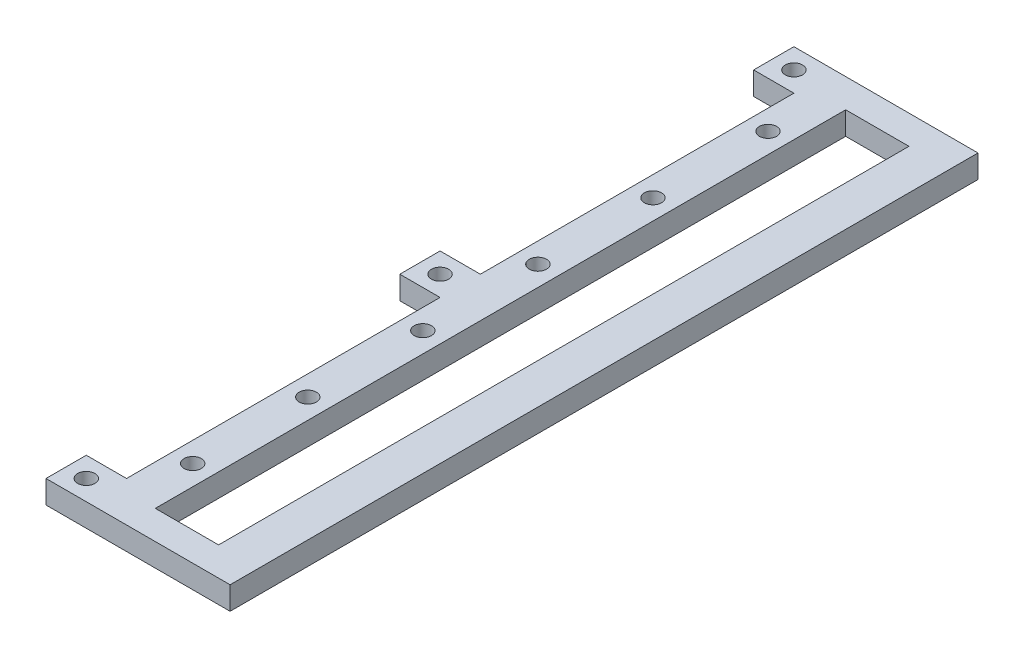
ISO-10303-21;
HEADER;
FILE_DESCRIPTION(('STEP AP214'),'2;1');
FILE_NAME('part.step','',(''),(''),'','','');
FILE_SCHEMA(('AUTOMOTIVE_DESIGN { 1 0 10303 214 1 1 1 1 }'));
ENDSEC;
DATA;
#1=APPLICATION_CONTEXT('core data for automotive mechanical design processes');
#2=APPLICATION_PROTOCOL_DEFINITION('international standard','automotive_design',2000,#1);
#3=PRODUCT_CONTEXT('',#1,'mechanical');
#4=PRODUCT('Part','Part','',(#3));
#5=PRODUCT_RELATED_PRODUCT_CATEGORY('part','',(#4));
#6=PRODUCT_DEFINITION_FORMATION('','',#4);
#7=PRODUCT_DEFINITION_CONTEXT('part definition',#1,'design');
#8=PRODUCT_DEFINITION('design','',#6,#7);
#9=PRODUCT_DEFINITION_SHAPE('','',#8);
#10=(LENGTH_UNIT() NAMED_UNIT(*) SI_UNIT(.MILLI.,.METRE.));
#11=(NAMED_UNIT(*) PLANE_ANGLE_UNIT() SI_UNIT($,.RADIAN.));
#12=(NAMED_UNIT(*) SI_UNIT($,.STERADIAN.) SOLID_ANGLE_UNIT());
#13=UNCERTAINTY_MEASURE_WITH_UNIT(LENGTH_MEASURE(1.E-05),#10,'distance_accuracy_value','');
#14=(GEOMETRIC_REPRESENTATION_CONTEXT(3) GLOBAL_UNCERTAINTY_ASSIGNED_CONTEXT((#13)) GLOBAL_UNIT_ASSIGNED_CONTEXT((#10,
#11,#12)) REPRESENTATION_CONTEXT('',''));
#15=CARTESIAN_POINT('',(0.,0.,0.));
#16=DIRECTION('',(0.,0.,1.));
#17=DIRECTION('',(1.,0.,0.));
#18=AXIS2_PLACEMENT_3D('',#15,#16,#17);
#19=CARTESIAN_POINT('',(0.,4.,0.));
#20=DIRECTION('',(0.,1.,0.));
#21=DIRECTION('',(0.,0.,1.));
#22=AXIS2_PLACEMENT_3D('',#19,#20,#21);
#23=PLANE('',#22);
#24=CARTESIAN_POINT('',(-16.,4.,0.));
#25=DIRECTION('',(0.,1.,0.));
#26=DIRECTION('',(0.,0.,1.));
#27=AXIS2_PLACEMENT_3D('',#24,#25,#26);
#28=CIRCLE('',#27,1.5);
#29=CARTESIAN_POINT('',(-16.,4.,1.50000000000001));
#30=VERTEX_POINT('',#29);
#31=EDGE_CURVE('E379',#30,#30,#28,.T.);
#32=ORIENTED_EDGE('',*,*,#31,.F.);
#33=EDGE_LOOP('',(#32));
#34=FACE_BOUND('',#33,.T.);
#35=CARTESIAN_POINT('',(-8.99999999999864,4.,30.));
#36=DIRECTION('',(0.,1.,0.));
#37=DIRECTION('',(0.,0.,-1.));
#38=AXIS2_PLACEMENT_3D('',#35,#36,#37);
#39=CIRCLE('',#38,1.5);
#40=CARTESIAN_POINT('',(-8.99999999999864,4.,28.5));
#41=VERTEX_POINT('',#40);
#42=EDGE_CURVE('E392',#41,#41,#39,.T.);
#43=ORIENTED_EDGE('',*,*,#42,.F.);
#44=EDGE_LOOP('',(#43));
#45=FACE_BOUND('',#44,.T.);
#46=CARTESIAN_POINT('',(-8.99999999999947,4.,-50.));
#47=DIRECTION('',(0.,1.,0.));
#48=DIRECTION('',(0.,0.,-1.));
#49=AXIS2_PLACEMENT_3D('',#46,#47,#48);
#50=CIRCLE('',#49,1.5);
#51=CARTESIAN_POINT('',(-8.99999999999947,4.,-51.5));
#52=VERTEX_POINT('',#51);
#53=EDGE_CURVE('E408',#52,#52,#50,.T.);
#54=ORIENTED_EDGE('',*,*,#53,.F.);
#55=EDGE_LOOP('',(#54));
#56=FACE_BOUND('',#55,.T.);
#57=CARTESIAN_POINT('',(-8.99999999999926,4.,-30.));
#58=DIRECTION('',(0.,1.,0.));
#59=DIRECTION('',(0.,0.,-1.));
#60=AXIS2_PLACEMENT_3D('',#57,#58,#59);
#61=CIRCLE('',#60,1.5);
#62=CARTESIAN_POINT('',(-8.99999999999926,4.,-31.5));
#63=VERTEX_POINT('',#62);
#64=EDGE_CURVE('E409',#63,#63,#61,.T.);
#65=ORIENTED_EDGE('',*,*,#64,.F.);
#66=EDGE_LOOP('',(#65));
#67=FACE_BOUND('',#66,.T.);
#68=DIRECTION('',(1.,0.,0.));
#69=VECTOR('',#68,1.);
#70=CARTESIAN_POINT('',(-5.49999999999999,4.,60.));
#71=LINE('',#70,#69);
#72=CARTESIAN_POINT('',(-5.49999999999999,4.,60.));
#73=VERTEX_POINT('',#72);
#74=CARTESIAN_POINT('',(5.50000000000001,4.,60.));
#75=VERTEX_POINT('',#74);
#76=EDGE_CURVE('E159',#73,#75,#71,.T.);
#77=ORIENTED_EDGE('',*,*,#76,.F.);
#78=DIRECTION('',(0.,0.,1.));
#79=VECTOR('',#78,1.);
#80=CARTESIAN_POINT('',(-5.50000000000001,4.,-60.));
#81=LINE('',#80,#79);
#82=CARTESIAN_POINT('',(-5.50000000000001,4.,-60.));
#83=VERTEX_POINT('',#82);
#84=EDGE_CURVE('E150',#83,#73,#81,.T.);
#85=ORIENTED_EDGE('',*,*,#84,.F.);
#86=DIRECTION('',(-1.,0.,0.));
#87=VECTOR('',#86,1.);
#88=CARTESIAN_POINT('',(-5.50000000000001,4.,-60.));
#89=LINE('',#88,#87);
#90=CARTESIAN_POINT('',(5.49999999999999,4.,-60.));
#91=VERTEX_POINT('',#90);
#92=EDGE_CURVE('E177',#91,#83,#89,.T.);
#93=ORIENTED_EDGE('',*,*,#92,.F.);
#94=DIRECTION('',(0.,0.,-1.));
#95=VECTOR('',#94,1.);
#96=CARTESIAN_POINT('',(5.49999999999999,4.,-60.));
#97=LINE('',#96,#95);
#98=EDGE_CURVE('E172',#75,#91,#97,.T.);
#99=ORIENTED_EDGE('',*,*,#98,.F.);
#100=EDGE_LOOP('',(#77,#85,#93,#99));
#101=FACE_BOUND('',#100,.T.);
#102=DIRECTION('',(0.,0.,-1.));
#103=VECTOR('',#102,1.);
#104=CARTESIAN_POINT('',(12.5,4.,-65.));
#105=LINE('',#104,#103);
#106=CARTESIAN_POINT('',(12.5,4.,65.));
#107=VERTEX_POINT('',#106);
#108=CARTESIAN_POINT('',(12.5,4.,-65.));
#109=VERTEX_POINT('',#108);
#110=EDGE_CURVE('E206',#107,#109,#105,.T.);
#111=ORIENTED_EDGE('',*,*,#110,.T.);
#112=DIRECTION('',(-1.,0.,0.));
#113=VECTOR('',#112,1.);
#114=CARTESIAN_POINT('',(-12.5,4.,-65.));
#115=LINE('',#114,#113);
#116=CARTESIAN_POINT('',(-19.5,4.,-65.));
#117=VERTEX_POINT('',#116);
#118=EDGE_CURVE('E211',#109,#117,#115,.T.);
#119=ORIENTED_EDGE('',*,*,#118,.T.);
#120=DIRECTION('',(0.,0.,1.));
#121=VECTOR('',#120,1.);
#122=CARTESIAN_POINT('',(-19.5,4.,-65.));
#123=LINE('',#122,#121);
#124=CARTESIAN_POINT('',(-19.5,4.,-58.));
#125=VERTEX_POINT('',#124);
#126=EDGE_CURVE('E220',#117,#125,#123,.T.);
#127=ORIENTED_EDGE('',*,*,#126,.T.);
#128=DIRECTION('',(1.,0.,0.));
#129=VECTOR('',#128,1.);
#130=CARTESIAN_POINT('',(-19.5,4.,-58.));
#131=LINE('',#130,#129);
#132=CARTESIAN_POINT('',(-12.5,4.,-58.));
#133=VERTEX_POINT('',#132);
#134=EDGE_CURVE('E223',#125,#133,#131,.T.);
#135=ORIENTED_EDGE('',*,*,#134,.T.);
#136=DIRECTION('',(0.,0.,1.));
#137=VECTOR('',#136,1.);
#138=CARTESIAN_POINT('',(-12.5,4.,-58.));
#139=LINE('',#138,#137);
#140=CARTESIAN_POINT('',(-12.5,4.,-3.5));
#141=VERTEX_POINT('',#140);
#142=EDGE_CURVE('E227',#133,#141,#139,.T.);
#143=ORIENTED_EDGE('',*,*,#142,.T.);
#144=DIRECTION('',(-1.,0.,0.));
#145=VECTOR('',#144,1.);
#146=CARTESIAN_POINT('',(-12.5,4.,-3.5));
#147=LINE('',#146,#145);
#148=CARTESIAN_POINT('',(-19.5,4.,-3.5));
#149=VERTEX_POINT('',#148);
#150=EDGE_CURVE('E231',#141,#149,#147,.T.);
#151=ORIENTED_EDGE('',*,*,#150,.T.);
#152=DIRECTION('',(0.,0.,1.));
#153=VECTOR('',#152,1.);
#154=CARTESIAN_POINT('',(-19.5,4.,-3.5));
#155=LINE('',#154,#153);
#156=CARTESIAN_POINT('',(-19.5,4.,3.5));
#157=VERTEX_POINT('',#156);
#158=EDGE_CURVE('E239',#149,#157,#155,.T.);
#159=ORIENTED_EDGE('',*,*,#158,.T.);
#160=DIRECTION('',(1.,0.,0.));
#161=VECTOR('',#160,1.);
#162=CARTESIAN_POINT('',(-19.5,4.,3.5));
#163=LINE('',#162,#161);
#164=CARTESIAN_POINT('',(-12.5,4.,3.5));
#165=VERTEX_POINT('',#164);
#166=EDGE_CURVE('E242',#157,#165,#163,.T.);
#167=ORIENTED_EDGE('',*,*,#166,.T.);
#168=DIRECTION('',(0.,0.,1.));
#169=VECTOR('',#168,1.);
#170=CARTESIAN_POINT('',(-12.5,4.,3.5));
#171=LINE('',#170,#169);
#172=CARTESIAN_POINT('',(-12.5,4.,58.));
#173=VERTEX_POINT('',#172);
#174=EDGE_CURVE('E246',#165,#173,#171,.T.);
#175=ORIENTED_EDGE('',*,*,#174,.T.);
#176=DIRECTION('',(-1.,0.,0.));
#177=VECTOR('',#176,1.);
#178=CARTESIAN_POINT('',(-19.5,4.,58.));
#179=LINE('',#178,#177);
#180=CARTESIAN_POINT('',(-19.5,4.,58.));
#181=VERTEX_POINT('',#180);
#182=EDGE_CURVE('E250',#173,#181,#179,.T.);
#183=ORIENTED_EDGE('',*,*,#182,.T.);
#184=DIRECTION('',(0.,0.,1.));
#185=VECTOR('',#184,1.);
#186=CARTESIAN_POINT('',(-19.5,4.,65.));
#187=LINE('',#186,#185);
#188=CARTESIAN_POINT('',(-19.5,4.,65.));
#189=VERTEX_POINT('',#188);
#190=EDGE_CURVE('E258',#181,#189,#187,.T.);
#191=ORIENTED_EDGE('',*,*,#190,.T.);
#192=DIRECTION('',(1.,0.,0.));
#193=VECTOR('',#192,1.);
#194=CARTESIAN_POINT('',(-12.5,4.,65.));
#195=LINE('',#194,#193);
#196=EDGE_CURVE('E261',#189,#107,#195,.T.);
#197=ORIENTED_EDGE('',*,*,#196,.T.);
#198=EDGE_LOOP('',(#111,#119,#127,#135,#143,#151,#159,#167,#175,#183,#191,#197));
#199=FACE_BOUND('',#198,.T.);
#200=CARTESIAN_POINT('',(-8.99999999999947,4.,50.));
#201=DIRECTION('',(0.,1.,0.));
#202=DIRECTION('',(0.,0.,1.));
#203=AXIS2_PLACEMENT_3D('',#200,#201,#202);
#204=CIRCLE('',#203,1.5);
#205=CARTESIAN_POINT('',(-8.99999999999947,4.,51.5));
#206=VERTEX_POINT('',#205);
#207=EDGE_CURVE('E196',#206,#206,#204,.T.);
#208=ORIENTED_EDGE('',*,*,#207,.F.);
#209=EDGE_LOOP('',(#208));
#210=FACE_BOUND('',#209,.T.);
#211=CARTESIAN_POINT('',(-8.99999999999905,4.,-9.99999999999999));
#212=DIRECTION('',(0.,1.,0.));
#213=DIRECTION('',(0.,0.,-1.));
#214=AXIS2_PLACEMENT_3D('',#211,#212,#213);
#215=CIRCLE('',#214,1.5);
#216=CARTESIAN_POINT('',(-8.99999999999905,4.,-11.5));
#217=VERTEX_POINT('',#216);
#218=EDGE_CURVE('E354',#217,#217,#215,.T.);
#219=ORIENTED_EDGE('',*,*,#218,.F.);
#220=EDGE_LOOP('',(#219));
#221=FACE_BOUND('',#220,.T.);
#222=CARTESIAN_POINT('',(-8.99999999999885,4.,10.));
#223=DIRECTION('',(0.,1.,0.));
#224=DIRECTION('',(0.,0.,-1.));
#225=AXIS2_PLACEMENT_3D('',#222,#223,#224);
#226=CIRCLE('',#225,1.5);
#227=CARTESIAN_POINT('',(-8.99999999999885,4.,8.50000000000001));
#228=VERTEX_POINT('',#227);
#229=EDGE_CURVE('E360',#228,#228,#226,.T.);
#230=ORIENTED_EDGE('',*,*,#229,.F.);
#231=EDGE_LOOP('',(#230));
#232=FACE_BOUND('',#231,.T.);
#233=CARTESIAN_POINT('',(-16.,4.,-61.5));
#234=DIRECTION('',(0.,1.,0.));
#235=DIRECTION('',(0.,0.,1.));
#236=AXIS2_PLACEMENT_3D('',#233,#234,#235);
#237=CIRCLE('',#236,1.5);
#238=CARTESIAN_POINT('',(-16.,4.,-60.));
#239=VERTEX_POINT('',#238);
#240=EDGE_CURVE('E366',#239,#239,#237,.T.);
#241=ORIENTED_EDGE('',*,*,#240,.F.);
#242=EDGE_LOOP('',(#241));
#243=FACE_BOUND('',#242,.T.);
#244=CARTESIAN_POINT('',(-16.,4.,61.5));
#245=DIRECTION('',(0.,1.,0.));
#246=DIRECTION('',(0.,0.,-1.));
#247=AXIS2_PLACEMENT_3D('',#244,#245,#246);
#248=CIRCLE('',#247,1.5);
#249=CARTESIAN_POINT('',(-16.,4.,60.));
#250=VERTEX_POINT('',#249);
#251=EDGE_CURVE('E372',#250,#250,#248,.T.);
#252=ORIENTED_EDGE('',*,*,#251,.F.);
#253=EDGE_LOOP('',(#252));
#254=FACE_BOUND('',#253,.T.);
#255=ADVANCED_FACE('F37',(#34,#45,#56,#67,#101,#199,#210,#221,#232,#243,#254),#23,.T.);
#256=CARTESIAN_POINT('',(0.,0.,0.));
#257=DIRECTION('',(0.,1.,0.));
#258=DIRECTION('',(0.,0.,1.));
#259=AXIS2_PLACEMENT_3D('',#256,#257,#258);
#260=PLANE('',#259);
#261=DIRECTION('',(0.,0.,-1.));
#262=VECTOR('',#261,1.);
#263=CARTESIAN_POINT('',(12.5,0.,-65.));
#264=LINE('',#263,#262);
#265=CARTESIAN_POINT('',(12.5,0.,65.));
#266=VERTEX_POINT('',#265);
#267=CARTESIAN_POINT('',(12.5,0.,-65.));
#268=VERTEX_POINT('',#267);
#269=EDGE_CURVE('E167',#266,#268,#264,.T.);
#270=ORIENTED_EDGE('',*,*,#269,.F.);
#271=DIRECTION('',(1.,0.,0.));
#272=VECTOR('',#271,1.);
#273=CARTESIAN_POINT('',(-12.5,0.,65.));
#274=LINE('',#273,#272);
#275=CARTESIAN_POINT('',(-19.5,0.,65.));
#276=VERTEX_POINT('',#275);
#277=EDGE_CURVE('E212',#276,#266,#274,.T.);
#278=ORIENTED_EDGE('',*,*,#277,.F.);
#279=DIRECTION('',(0.,0.,1.));
#280=VECTOR('',#279,1.);
#281=CARTESIAN_POINT('',(-19.5,0.,65.));
#282=LINE('',#281,#280);
#283=CARTESIAN_POINT('',(-19.5,0.,58.));
#284=VERTEX_POINT('',#283);
#285=EDGE_CURVE('E286',#284,#276,#282,.T.);
#286=ORIENTED_EDGE('',*,*,#285,.F.);
#287=DIRECTION('',(-1.,0.,0.));
#288=VECTOR('',#287,1.);
#289=CARTESIAN_POINT('',(-19.5,0.,58.));
#290=LINE('',#289,#288);
#291=CARTESIAN_POINT('',(-12.5,0.,58.));
#292=VERTEX_POINT('',#291);
#293=EDGE_CURVE('E284',#292,#284,#290,.T.);
#294=ORIENTED_EDGE('',*,*,#293,.F.);
#295=DIRECTION('',(0.,0.,1.));
#296=VECTOR('',#295,1.);
#297=CARTESIAN_POINT('',(-12.5,0.,3.5));
#298=LINE('',#297,#296);
#299=CARTESIAN_POINT('',(-12.5,0.,3.5));
#300=VERTEX_POINT('',#299);
#301=EDGE_CURVE('E282',#300,#292,#298,.T.);
#302=ORIENTED_EDGE('',*,*,#301,.F.);
#303=DIRECTION('',(1.,0.,0.));
#304=VECTOR('',#303,1.);
#305=CARTESIAN_POINT('',(-19.5,0.,3.5));
#306=LINE('',#305,#304);
#307=CARTESIAN_POINT('',(-19.5,0.,3.5));
#308=VERTEX_POINT('',#307);
#309=EDGE_CURVE('E280',#308,#300,#306,.T.);
#310=ORIENTED_EDGE('',*,*,#309,.F.);
#311=DIRECTION('',(0.,0.,1.));
#312=VECTOR('',#311,1.);
#313=CARTESIAN_POINT('',(-19.5,0.,-3.5));
#314=LINE('',#313,#312);
#315=CARTESIAN_POINT('',(-19.5,0.,-3.5));
#316=VERTEX_POINT('',#315);
#317=EDGE_CURVE('E278',#316,#308,#314,.T.);
#318=ORIENTED_EDGE('',*,*,#317,.F.);
#319=DIRECTION('',(-1.,0.,0.));
#320=VECTOR('',#319,1.);
#321=CARTESIAN_POINT('',(-12.5,0.,-3.5));
#322=LINE('',#321,#320);
#323=CARTESIAN_POINT('',(-12.5,0.,-3.5));
#324=VERTEX_POINT('',#323);
#325=EDGE_CURVE('E276',#324,#316,#322,.T.);
#326=ORIENTED_EDGE('',*,*,#325,.F.);
#327=DIRECTION('',(0.,0.,1.));
#328=VECTOR('',#327,1.);
#329=CARTESIAN_POINT('',(-12.5,0.,-58.));
#330=LINE('',#329,#328);
#331=CARTESIAN_POINT('',(-12.5,0.,-58.));
#332=VERTEX_POINT('',#331);
#333=EDGE_CURVE('E274',#332,#324,#330,.T.);
#334=ORIENTED_EDGE('',*,*,#333,.F.);
#335=DIRECTION('',(1.,0.,0.));
#336=VECTOR('',#335,1.);
#337=CARTESIAN_POINT('',(-19.5,0.,-58.));
#338=LINE('',#337,#336);
#339=CARTESIAN_POINT('',(-19.5,0.,-58.));
#340=VERTEX_POINT('',#339);
#341=EDGE_CURVE('E272',#340,#332,#338,.T.);
#342=ORIENTED_EDGE('',*,*,#341,.F.);
#343=DIRECTION('',(0.,0.,1.));
#344=VECTOR('',#343,1.);
#345=CARTESIAN_POINT('',(-19.5,0.,-65.));
#346=LINE('',#345,#344);
#347=CARTESIAN_POINT('',(-19.5,0.,-65.));
#348=VERTEX_POINT('',#347);
#349=EDGE_CURVE('E270',#348,#340,#346,.T.);
#350=ORIENTED_EDGE('',*,*,#349,.F.);
#351=DIRECTION('',(-1.,0.,0.));
#352=VECTOR('',#351,1.);
#353=CARTESIAN_POINT('',(-12.5,0.,-65.));
#354=LINE('',#353,#352);
#355=EDGE_CURVE('E268',#268,#348,#354,.T.);
#356=ORIENTED_EDGE('',*,*,#355,.F.);
#357=EDGE_LOOP('',(#270,#278,#286,#294,#302,#310,#318,#326,#334,#342,#350,#356));
#358=FACE_BOUND('',#357,.T.);
#359=DIRECTION('',(0.,0.,1.));
#360=VECTOR('',#359,1.);
#361=CARTESIAN_POINT('',(-5.50000000000001,0.,-60.));
#362=LINE('',#361,#360);
#363=CARTESIAN_POINT('',(-5.50000000000001,0.,-60.));
#364=VERTEX_POINT('',#363);
#365=CARTESIAN_POINT('',(-5.49999999999999,0.,60.));
#366=VERTEX_POINT('',#365);
#367=EDGE_CURVE('E60',#364,#366,#362,.T.);
#368=ORIENTED_EDGE('',*,*,#367,.T.);
#369=DIRECTION('',(1.,0.,0.));
#370=VECTOR('',#369,1.);
#371=CARTESIAN_POINT('',(-5.49999999999999,0.,60.));
#372=LINE('',#371,#370);
#373=CARTESIAN_POINT('',(5.50000000000001,0.,60.));
#374=VERTEX_POINT('',#373);
#375=EDGE_CURVE('E166',#366,#374,#372,.T.);
#376=ORIENTED_EDGE('',*,*,#375,.T.);
#377=DIRECTION('',(0.,0.,-1.));
#378=VECTOR('',#377,1.);
#379=CARTESIAN_POINT('',(5.49999999999999,0.,-60.));
#380=LINE('',#379,#378);
#381=CARTESIAN_POINT('',(5.49999999999999,0.,-60.));
#382=VERTEX_POINT('',#381);
#383=EDGE_CURVE('E198',#374,#382,#380,.T.);
#384=ORIENTED_EDGE('',*,*,#383,.T.);
#385=DIRECTION('',(-1.,0.,0.));
#386=VECTOR('',#385,1.);
#387=CARTESIAN_POINT('',(-5.50000000000001,0.,-60.));
#388=LINE('',#387,#386);
#389=EDGE_CURVE('E160',#382,#364,#388,.T.);
#390=ORIENTED_EDGE('',*,*,#389,.T.);
#391=EDGE_LOOP('',(#368,#376,#384,#390));
#392=FACE_BOUND('',#391,.T.);
#393=CARTESIAN_POINT('',(-8.99999999999947,0.,50.));
#394=DIRECTION('',(0.,1.,0.));
#395=DIRECTION('',(0.,0.,1.));
#396=AXIS2_PLACEMENT_3D('',#393,#394,#395);
#397=CIRCLE('',#396,1.5);
#398=CARTESIAN_POINT('',(-8.99999999999947,0.,51.5));
#399=VERTEX_POINT('',#398);
#400=EDGE_CURVE('E352',#399,#399,#397,.T.);
#401=ORIENTED_EDGE('',*,*,#400,.T.);
#402=EDGE_LOOP('',(#401));
#403=FACE_BOUND('',#402,.T.);
#404=CARTESIAN_POINT('',(-8.99999999999926,0.,-30.));
#405=DIRECTION('',(0.,1.,0.));
#406=DIRECTION('',(0.,0.,-1.));
#407=AXIS2_PLACEMENT_3D('',#404,#405,#406);
#408=CIRCLE('',#407,1.5);
#409=CARTESIAN_POINT('',(-8.99999999999926,0.,-31.5));
#410=VERTEX_POINT('',#409);
#411=EDGE_CURVE('E357',#410,#410,#408,.T.);
#412=ORIENTED_EDGE('',*,*,#411,.T.);
#413=EDGE_LOOP('',(#412));
#414=FACE_BOUND('',#413,.T.);
#415=CARTESIAN_POINT('',(-8.99999999999905,0.,-9.99999999999999));
#416=DIRECTION('',(0.,1.,0.));
#417=DIRECTION('',(0.,0.,-1.));
#418=AXIS2_PLACEMENT_3D('',#415,#416,#417);
#419=CIRCLE('',#418,1.5);
#420=CARTESIAN_POINT('',(-8.99999999999905,0.,-11.5));
#421=VERTEX_POINT('',#420);
#422=EDGE_CURVE('E358',#421,#421,#419,.T.);
#423=ORIENTED_EDGE('',*,*,#422,.T.);
#424=EDGE_LOOP('',(#423));
#425=FACE_BOUND('',#424,.T.);
#426=CARTESIAN_POINT('',(-8.99999999999947,0.,-50.));
#427=DIRECTION('',(0.,1.,0.));
#428=DIRECTION('',(0.,0.,-1.));
#429=AXIS2_PLACEMENT_3D('',#426,#427,#428);
#430=CIRCLE('',#429,1.5);
#431=CARTESIAN_POINT('',(-8.99999999999947,0.,-51.5));
#432=VERTEX_POINT('',#431);
#433=EDGE_CURVE('E363',#432,#432,#430,.T.);
#434=ORIENTED_EDGE('',*,*,#433,.T.);
#435=EDGE_LOOP('',(#434));
#436=FACE_BOUND('',#435,.T.);
#437=CARTESIAN_POINT('',(-8.99999999999885,0.,10.));
#438=DIRECTION('',(0.,1.,0.));
#439=DIRECTION('',(0.,0.,-1.));
#440=AXIS2_PLACEMENT_3D('',#437,#438,#439);
#441=CIRCLE('',#440,1.5);
#442=CARTESIAN_POINT('',(-8.99999999999885,0.,8.50000000000001));
#443=VERTEX_POINT('',#442);
#444=EDGE_CURVE('E364',#443,#443,#441,.T.);
#445=ORIENTED_EDGE('',*,*,#444,.T.);
#446=EDGE_LOOP('',(#445));
#447=FACE_BOUND('',#446,.T.);
#448=CARTESIAN_POINT('',(-8.99999999999864,0.,30.));
#449=DIRECTION('',(0.,1.,0.));
#450=DIRECTION('',(0.,0.,-1.));
#451=AXIS2_PLACEMENT_3D('',#448,#449,#450);
#452=CIRCLE('',#451,1.5);
#453=CARTESIAN_POINT('',(-8.99999999999864,0.,28.5));
#454=VERTEX_POINT('',#453);
#455=EDGE_CURVE('E369',#454,#454,#452,.T.);
#456=ORIENTED_EDGE('',*,*,#455,.T.);
#457=EDGE_LOOP('',(#456));
#458=FACE_BOUND('',#457,.T.);
#459=CARTESIAN_POINT('',(-16.,0.,-61.5));
#460=DIRECTION('',(0.,1.,0.));
#461=DIRECTION('',(0.,0.,1.));
#462=AXIS2_PLACEMENT_3D('',#459,#460,#461);
#463=CIRCLE('',#462,1.5);
#464=CARTESIAN_POINT('',(-16.,0.,-60.));
#465=VERTEX_POINT('',#464);
#466=EDGE_CURVE('E370',#465,#465,#463,.T.);
#467=ORIENTED_EDGE('',*,*,#466,.T.);
#468=EDGE_LOOP('',(#467));
#469=FACE_BOUND('',#468,.T.);
#470=CARTESIAN_POINT('',(-16.,0.,0.));
#471=DIRECTION('',(0.,1.,0.));
#472=DIRECTION('',(0.,0.,1.));
#473=AXIS2_PLACEMENT_3D('',#470,#471,#472);
#474=CIRCLE('',#473,1.5);
#475=CARTESIAN_POINT('',(-16.,0.,1.50000000000001));
#476=VERTEX_POINT('',#475);
#477=EDGE_CURVE('E374',#476,#476,#474,.T.);
#478=ORIENTED_EDGE('',*,*,#477,.T.);
#479=EDGE_LOOP('',(#478));
#480=FACE_BOUND('',#479,.T.);
#481=CARTESIAN_POINT('',(-16.,0.,61.5));
#482=DIRECTION('',(0.,1.,0.));
#483=DIRECTION('',(0.,0.,-1.));
#484=AXIS2_PLACEMENT_3D('',#481,#482,#483);
#485=CIRCLE('',#484,1.5);
#486=CARTESIAN_POINT('',(-16.,0.,60.));
#487=VERTEX_POINT('',#486);
#488=EDGE_CURVE('E375',#487,#487,#485,.T.);
#489=ORIENTED_EDGE('',*,*,#488,.T.);
#490=EDGE_LOOP('',(#489));
#491=FACE_BOUND('',#490,.T.);
#492=ADVANCED_FACE('F329',(#358,#392,#403,#414,#425,#436,#447,#458,#469,#480,#491),#260,.F.);
#493=CARTESIAN_POINT('',(12.5,4.,-65.));
#494=DIRECTION('',(-1.,0.,0.));
#495=DIRECTION('',(0.,0.,1.));
#496=AXIS2_PLACEMENT_3D('',#493,#494,#495);
#497=PLANE('',#496);
#498=ORIENTED_EDGE('',*,*,#269,.T.);
#499=DIRECTION('',(0.,-1.,0.));
#500=VECTOR('',#499,1.);
#501=CARTESIAN_POINT('',(12.5,4.,-65.));
#502=LINE('',#501,#500);
#503=EDGE_CURVE('E12',#109,#268,#502,.T.);
#504=ORIENTED_EDGE('',*,*,#503,.F.);
#505=ORIENTED_EDGE('',*,*,#110,.F.);
#506=DIRECTION('',(0.,-1.,0.));
#507=VECTOR('',#506,1.);
#508=CARTESIAN_POINT('',(12.5,4.,65.));
#509=LINE('',#508,#507);
#510=EDGE_CURVE('E265',#107,#266,#509,.T.);
#511=ORIENTED_EDGE('',*,*,#510,.T.);
#512=EDGE_LOOP('',(#498,#504,#505,#511));
#513=FACE_BOUND('',#512,.T.);
#514=ADVANCED_FACE('F39',(#513),#497,.F.);
#515=CARTESIAN_POINT('',(-12.5,4.,-65.));
#516=DIRECTION('',(0.,0.,1.));
#517=DIRECTION('',(1.,0.,0.));
#518=AXIS2_PLACEMENT_3D('',#515,#516,#517);
#519=PLANE('',#518);
#520=ORIENTED_EDGE('',*,*,#355,.T.);
#521=DIRECTION('',(0.,-1.,0.));
#522=VECTOR('',#521,1.);
#523=CARTESIAN_POINT('',(-19.5,4.,-65.));
#524=LINE('',#523,#522);
#525=EDGE_CURVE('E45',#117,#348,#524,.T.);
#526=ORIENTED_EDGE('',*,*,#525,.F.);
#527=ORIENTED_EDGE('',*,*,#118,.F.);
#528=ORIENTED_EDGE('',*,*,#503,.T.);
#529=EDGE_LOOP('',(#520,#526,#527,#528));
#530=FACE_BOUND('',#529,.T.);
#531=ADVANCED_FACE('F480',(#530),#519,.F.);
#532=CARTESIAN_POINT('',(-19.5,4.,-65.));
#533=DIRECTION('',(1.,0.,0.));
#534=DIRECTION('',(0.,0.,-1.));
#535=AXIS2_PLACEMENT_3D('',#532,#533,#534);
#536=PLANE('',#535);
#537=ORIENTED_EDGE('',*,*,#349,.T.);
#538=DIRECTION('',(0.,-1.,0.));
#539=VECTOR('',#538,1.);
#540=CARTESIAN_POINT('',(-19.5,4.,-58.));
#541=LINE('',#540,#539);
#542=EDGE_CURVE('E316',#125,#340,#541,.T.);
#543=ORIENTED_EDGE('',*,*,#542,.F.);
#544=ORIENTED_EDGE('',*,*,#126,.F.);
#545=ORIENTED_EDGE('',*,*,#525,.T.);
#546=EDGE_LOOP('',(#537,#543,#544,#545));
#547=FACE_BOUND('',#546,.T.);
#548=ADVANCED_FACE('F323',(#547),#536,.F.);
#549=CARTESIAN_POINT('',(-19.5,4.,-58.));
#550=DIRECTION('',(0.,0.,-1.));
#551=DIRECTION('',(-1.,0.,0.));
#552=AXIS2_PLACEMENT_3D('',#549,#550,#551);
#553=PLANE('',#552);
#554=ORIENTED_EDGE('',*,*,#341,.T.);
#555=DIRECTION('',(0.,-1.,0.));
#556=VECTOR('',#555,1.);
#557=CARTESIAN_POINT('',(-12.5,4.,-58.));
#558=LINE('',#557,#556);
#559=EDGE_CURVE('E313',#133,#332,#558,.T.);
#560=ORIENTED_EDGE('',*,*,#559,.F.);
#561=ORIENTED_EDGE('',*,*,#134,.F.);
#562=ORIENTED_EDGE('',*,*,#542,.T.);
#563=EDGE_LOOP('',(#554,#560,#561,#562));
#564=FACE_BOUND('',#563,.T.);
#565=ADVANCED_FACE('F335',(#564),#553,.F.);
#566=CARTESIAN_POINT('',(-12.5,4.,-58.));
#567=DIRECTION('',(1.,0.,0.));
#568=DIRECTION('',(0.,0.,-1.));
#569=AXIS2_PLACEMENT_3D('',#566,#567,#568);
#570=PLANE('',#569);
#571=ORIENTED_EDGE('',*,*,#333,.T.);
#572=DIRECTION('',(0.,-1.,0.));
#573=VECTOR('',#572,1.);
#574=CARTESIAN_POINT('',(-12.5,4.,-3.5));
#575=LINE('',#574,#573);
#576=EDGE_CURVE('E310',#141,#324,#575,.T.);
#577=ORIENTED_EDGE('',*,*,#576,.F.);
#578=ORIENTED_EDGE('',*,*,#142,.F.);
#579=ORIENTED_EDGE('',*,*,#559,.T.);
#580=EDGE_LOOP('',(#571,#577,#578,#579));
#581=FACE_BOUND('',#580,.T.);
#582=ADVANCED_FACE('F339',(#581),#570,.F.);
#583=CARTESIAN_POINT('',(-12.5,4.,-3.5));
#584=DIRECTION('',(0.,0.,1.));
#585=DIRECTION('',(1.,0.,0.));
#586=AXIS2_PLACEMENT_3D('',#583,#584,#585);
#587=PLANE('',#586);
#588=ORIENTED_EDGE('',*,*,#325,.T.);
#589=DIRECTION('',(0.,-1.,0.));
#590=VECTOR('',#589,1.);
#591=CARTESIAN_POINT('',(-19.5,4.,-3.5));
#592=LINE('',#591,#590);
#593=EDGE_CURVE('E307',#149,#316,#592,.T.);
#594=ORIENTED_EDGE('',*,*,#593,.F.);
#595=ORIENTED_EDGE('',*,*,#150,.F.);
#596=ORIENTED_EDGE('',*,*,#576,.T.);
#597=EDGE_LOOP('',(#588,#594,#595,#596));
#598=FACE_BOUND('',#597,.T.);
#599=ADVANCED_FACE('F470',(#598),#587,.F.);
#600=CARTESIAN_POINT('',(-19.5,4.,-3.5));
#601=DIRECTION('',(1.,0.,0.));
#602=DIRECTION('',(0.,0.,-1.));
#603=AXIS2_PLACEMENT_3D('',#600,#601,#602);
#604=PLANE('',#603);
#605=ORIENTED_EDGE('',*,*,#317,.T.);
#606=DIRECTION('',(0.,-1.,0.));
#607=VECTOR('',#606,1.);
#608=CARTESIAN_POINT('',(-19.5,4.,3.5));
#609=LINE('',#608,#607);
#610=EDGE_CURVE('E304',#157,#308,#609,.T.);
#611=ORIENTED_EDGE('',*,*,#610,.F.);
#612=ORIENTED_EDGE('',*,*,#158,.F.);
#613=ORIENTED_EDGE('',*,*,#593,.T.);
#614=EDGE_LOOP('',(#605,#611,#612,#613));
#615=FACE_BOUND('',#614,.T.);
#616=ADVANCED_FACE('F466',(#615),#604,.F.);
#617=CARTESIAN_POINT('',(-19.5,4.,3.5));
#618=DIRECTION('',(0.,0.,-1.));
#619=DIRECTION('',(-1.,0.,0.));
#620=AXIS2_PLACEMENT_3D('',#617,#618,#619);
#621=PLANE('',#620);
#622=ORIENTED_EDGE('',*,*,#309,.T.);
#623=DIRECTION('',(0.,-1.,0.));
#624=VECTOR('',#623,1.);
#625=CARTESIAN_POINT('',(-12.5,4.,3.5));
#626=LINE('',#625,#624);
#627=EDGE_CURVE('E301',#165,#300,#626,.T.);
#628=ORIENTED_EDGE('',*,*,#627,.F.);
#629=ORIENTED_EDGE('',*,*,#166,.F.);
#630=ORIENTED_EDGE('',*,*,#610,.T.);
#631=EDGE_LOOP('',(#622,#628,#629,#630));
#632=FACE_BOUND('',#631,.T.);
#633=ADVANCED_FACE('F462',(#632),#621,.F.);
#634=CARTESIAN_POINT('',(-12.5,4.,3.5));
#635=DIRECTION('',(1.,0.,0.));
#636=DIRECTION('',(0.,0.,-1.));
#637=AXIS2_PLACEMENT_3D('',#634,#635,#636);
#638=PLANE('',#637);
#639=ORIENTED_EDGE('',*,*,#301,.T.);
#640=DIRECTION('',(0.,-1.,0.));
#641=VECTOR('',#640,1.);
#642=CARTESIAN_POINT('',(-12.5,4.,58.));
#643=LINE('',#642,#641);
#644=EDGE_CURVE('E298',#173,#292,#643,.T.);
#645=ORIENTED_EDGE('',*,*,#644,.F.);
#646=ORIENTED_EDGE('',*,*,#174,.F.);
#647=ORIENTED_EDGE('',*,*,#627,.T.);
#648=EDGE_LOOP('',(#639,#645,#646,#647));
#649=FACE_BOUND('',#648,.T.);
#650=ADVANCED_FACE('F458',(#649),#638,.F.);
#651=CARTESIAN_POINT('',(-19.5,4.,58.));
#652=DIRECTION('',(0.,0.,1.));
#653=DIRECTION('',(1.,0.,0.));
#654=AXIS2_PLACEMENT_3D('',#651,#652,#653);
#655=PLANE('',#654);
#656=ORIENTED_EDGE('',*,*,#293,.T.);
#657=DIRECTION('',(0.,-1.,0.));
#658=VECTOR('',#657,1.);
#659=CARTESIAN_POINT('',(-19.5,4.,58.));
#660=LINE('',#659,#658);
#661=EDGE_CURVE('E295',#181,#284,#660,.T.);
#662=ORIENTED_EDGE('',*,*,#661,.F.);
#663=ORIENTED_EDGE('',*,*,#182,.F.);
#664=ORIENTED_EDGE('',*,*,#644,.T.);
#665=EDGE_LOOP('',(#656,#662,#663,#664));
#666=FACE_BOUND('',#665,.T.);
#667=ADVANCED_FACE('F454',(#666),#655,.F.);
#668=CARTESIAN_POINT('',(-19.5,4.,65.));
#669=DIRECTION('',(1.,0.,0.));
#670=DIRECTION('',(0.,0.,-1.));
#671=AXIS2_PLACEMENT_3D('',#668,#669,#670);
#672=PLANE('',#671);
#673=ORIENTED_EDGE('',*,*,#285,.T.);
#674=DIRECTION('',(0.,-1.,0.));
#675=VECTOR('',#674,1.);
#676=CARTESIAN_POINT('',(-19.5,4.,65.));
#677=LINE('',#676,#675);
#678=EDGE_CURVE('E292',#189,#276,#677,.T.);
#679=ORIENTED_EDGE('',*,*,#678,.F.);
#680=ORIENTED_EDGE('',*,*,#190,.F.);
#681=ORIENTED_EDGE('',*,*,#661,.T.);
#682=EDGE_LOOP('',(#673,#679,#680,#681));
#683=FACE_BOUND('',#682,.T.);
#684=ADVANCED_FACE('F450',(#683),#672,.F.);
#685=CARTESIAN_POINT('',(-12.5,4.,65.));
#686=DIRECTION('',(0.,0.,-1.));
#687=DIRECTION('',(-1.,0.,0.));
#688=AXIS2_PLACEMENT_3D('',#685,#686,#687);
#689=PLANE('',#688);
#690=ORIENTED_EDGE('',*,*,#277,.T.);
#691=ORIENTED_EDGE('',*,*,#510,.F.);
#692=ORIENTED_EDGE('',*,*,#196,.F.);
#693=ORIENTED_EDGE('',*,*,#678,.T.);
#694=EDGE_LOOP('',(#690,#691,#692,#693));
#695=FACE_BOUND('',#694,.T.);
#696=ADVANCED_FACE('F447',(#695),#689,.F.);
#697=CARTESIAN_POINT('',(-5.50000000000001,4.,-60.));
#698=DIRECTION('',(1.,0.,0.));
#699=DIRECTION('',(0.,0.,-1.));
#700=AXIS2_PLACEMENT_3D('',#697,#698,#699);
#701=PLANE('',#700);
#702=ORIENTED_EDGE('',*,*,#367,.F.);
#703=DIRECTION('',(0.,-1.,0.));
#704=VECTOR('',#703,1.);
#705=CARTESIAN_POINT('',(-5.50000000000001,4.,-60.));
#706=LINE('',#705,#704);
#707=EDGE_CURVE('E154',#83,#364,#706,.T.);
#708=ORIENTED_EDGE('',*,*,#707,.F.);
#709=ORIENTED_EDGE('',*,*,#84,.T.);
#710=DIRECTION('',(0.,-1.,0.));
#711=VECTOR('',#710,1.);
#712=CARTESIAN_POINT('',(-5.49999999999999,4.,60.));
#713=LINE('',#712,#711);
#714=EDGE_CURVE('E153',#73,#366,#713,.T.);
#715=ORIENTED_EDGE('',*,*,#714,.T.);
#716=EDGE_LOOP('',(#702,#708,#709,#715));
#717=FACE_BOUND('',#716,.T.);
#718=ADVANCED_FACE('F152',(#717),#701,.T.);
#719=CARTESIAN_POINT('',(-5.49999999999999,4.,60.));
#720=DIRECTION('',(0.,0.,-1.));
#721=DIRECTION('',(-1.,0.,0.));
#722=AXIS2_PLACEMENT_3D('',#719,#720,#721);
#723=PLANE('',#722);
#724=ORIENTED_EDGE('',*,*,#375,.F.);
#725=ORIENTED_EDGE('',*,*,#714,.F.);
#726=ORIENTED_EDGE('',*,*,#76,.T.);
#727=DIRECTION('',(0.,-1.,0.));
#728=VECTOR('',#727,1.);
#729=CARTESIAN_POINT('',(5.50000000000001,4.,60.));
#730=LINE('',#729,#728);
#731=EDGE_CURVE('E168',#75,#374,#730,.T.);
#732=ORIENTED_EDGE('',*,*,#731,.T.);
#733=EDGE_LOOP('',(#724,#725,#726,#732));
#734=FACE_BOUND('',#733,.T.);
#735=ADVANCED_FACE('F163',(#734),#723,.T.);
#736=CARTESIAN_POINT('',(5.49999999999999,4.,-60.));
#737=DIRECTION('',(-1.,0.,0.));
#738=DIRECTION('',(0.,0.,1.));
#739=AXIS2_PLACEMENT_3D('',#736,#737,#738);
#740=PLANE('',#739);
#741=ORIENTED_EDGE('',*,*,#383,.F.);
#742=ORIENTED_EDGE('',*,*,#731,.F.);
#743=ORIENTED_EDGE('',*,*,#98,.T.);
#744=DIRECTION('',(0.,-1.,0.));
#745=VECTOR('',#744,1.);
#746=CARTESIAN_POINT('',(5.49999999999999,4.,-60.));
#747=LINE('',#746,#745);
#748=EDGE_CURVE('E52',#91,#382,#747,.T.);
#749=ORIENTED_EDGE('',*,*,#748,.T.);
#750=EDGE_LOOP('',(#741,#742,#743,#749));
#751=FACE_BOUND('',#750,.T.);
#752=ADVANCED_FACE('F433',(#751),#740,.T.);
#753=CARTESIAN_POINT('',(-5.50000000000001,4.,-60.));
#754=DIRECTION('',(0.,0.,1.));
#755=DIRECTION('',(1.,0.,0.));
#756=AXIS2_PLACEMENT_3D('',#753,#754,#755);
#757=PLANE('',#756);
#758=ORIENTED_EDGE('',*,*,#389,.F.);
#759=ORIENTED_EDGE('',*,*,#748,.F.);
#760=ORIENTED_EDGE('',*,*,#92,.T.);
#761=ORIENTED_EDGE('',*,*,#707,.T.);
#762=EDGE_LOOP('',(#758,#759,#760,#761));
#763=FACE_BOUND('',#762,.T.);
#764=ADVANCED_FACE('F423',(#763),#757,.T.);
#765=CARTESIAN_POINT('',(-8.99999999999947,4.,50.));
#766=DIRECTION('',(0.,-1.,0.));
#767=DIRECTION('',(0.,0.,-1.));
#768=AXIS2_PLACEMENT_3D('',#765,#766,#767);
#769=CYLINDRICAL_SURFACE('',#768,1.5);
#770=ORIENTED_EDGE('',*,*,#207,.T.);
#771=EDGE_LOOP('',(#770));
#772=FACE_BOUND('',#771,.T.);
#773=ORIENTED_EDGE('',*,*,#400,.F.);
#774=EDGE_LOOP('',(#773));
#775=FACE_BOUND('',#774,.T.);
#776=ADVANCED_FACE('F420',(#772,#775),#769,.F.);
#777=CARTESIAN_POINT('',(-8.99999999999926,4.,-30.));
#778=DIRECTION('',(0.,-1.,0.));
#779=DIRECTION('',(0.,0.,-1.));
#780=AXIS2_PLACEMENT_3D('',#777,#778,#779);
#781=CYLINDRICAL_SURFACE('',#780,1.5);
#782=ORIENTED_EDGE('',*,*,#64,.T.);
#783=EDGE_LOOP('',(#782));
#784=FACE_BOUND('',#783,.T.);
#785=ORIENTED_EDGE('',*,*,#411,.F.);
#786=EDGE_LOOP('',(#785));
#787=FACE_BOUND('',#786,.T.);
#788=ADVANCED_FACE('F422',(#784,#787),#781,.F.);
#789=CARTESIAN_POINT('',(-8.99999999999905,4.,-9.99999999999999));
#790=DIRECTION('',(0.,-1.,0.));
#791=DIRECTION('',(0.,0.,-1.));
#792=AXIS2_PLACEMENT_3D('',#789,#790,#791);
#793=CYLINDRICAL_SURFACE('',#792,1.5);
#794=ORIENTED_EDGE('',*,*,#218,.T.);
#795=EDGE_LOOP('',(#794));
#796=FACE_BOUND('',#795,.T.);
#797=ORIENTED_EDGE('',*,*,#422,.F.);
#798=EDGE_LOOP('',(#797));
#799=FACE_BOUND('',#798,.T.);
#800=ADVANCED_FACE('F430',(#796,#799),#793,.F.);
#801=CARTESIAN_POINT('',(-8.99999999999947,4.,-50.));
#802=DIRECTION('',(0.,-1.,0.));
#803=DIRECTION('',(0.,0.,-1.));
#804=AXIS2_PLACEMENT_3D('',#801,#802,#803);
#805=CYLINDRICAL_SURFACE('',#804,1.5);
#806=ORIENTED_EDGE('',*,*,#53,.T.);
#807=EDGE_LOOP('',(#806));
#808=FACE_BOUND('',#807,.T.);
#809=ORIENTED_EDGE('',*,*,#433,.F.);
#810=EDGE_LOOP('',(#809));
#811=FACE_BOUND('',#810,.T.);
#812=ADVANCED_FACE('F619',(#808,#811),#805,.F.);
#813=CARTESIAN_POINT('',(-8.99999999999885,4.,10.));
#814=DIRECTION('',(0.,-1.,0.));
#815=DIRECTION('',(0.,0.,-1.));
#816=AXIS2_PLACEMENT_3D('',#813,#814,#815);
#817=CYLINDRICAL_SURFACE('',#816,1.5);
#818=ORIENTED_EDGE('',*,*,#229,.T.);
#819=EDGE_LOOP('',(#818));
#820=FACE_BOUND('',#819,.T.);
#821=ORIENTED_EDGE('',*,*,#444,.F.);
#822=EDGE_LOOP('',(#821));
#823=FACE_BOUND('',#822,.T.);
#824=ADVANCED_FACE('F628',(#820,#823),#817,.F.);
#825=CARTESIAN_POINT('',(-8.99999999999864,4.,30.));
#826=DIRECTION('',(0.,-1.,0.));
#827=DIRECTION('',(0.,0.,-1.));
#828=AXIS2_PLACEMENT_3D('',#825,#826,#827);
#829=CYLINDRICAL_SURFACE('',#828,1.5);
#830=ORIENTED_EDGE('',*,*,#42,.T.);
#831=EDGE_LOOP('',(#830));
#832=FACE_BOUND('',#831,.T.);
#833=ORIENTED_EDGE('',*,*,#455,.F.);
#834=EDGE_LOOP('',(#833));
#835=FACE_BOUND('',#834,.T.);
#836=ADVANCED_FACE('F637',(#832,#835),#829,.F.);
#837=CARTESIAN_POINT('',(-16.,4.,-61.5));
#838=DIRECTION('',(0.,-1.,0.));
#839=DIRECTION('',(0.,0.,-1.));
#840=AXIS2_PLACEMENT_3D('',#837,#838,#839);
#841=CYLINDRICAL_SURFACE('',#840,1.5);
#842=ORIENTED_EDGE('',*,*,#240,.T.);
#843=EDGE_LOOP('',(#842));
#844=FACE_BOUND('',#843,.T.);
#845=ORIENTED_EDGE('',*,*,#466,.F.);
#846=EDGE_LOOP('',(#845));
#847=FACE_BOUND('',#846,.T.);
#848=ADVANCED_FACE('F646',(#844,#847),#841,.F.);
#849=CARTESIAN_POINT('',(-16.,4.,0.));
#850=DIRECTION('',(0.,-1.,0.));
#851=DIRECTION('',(0.,0.,-1.));
#852=AXIS2_PLACEMENT_3D('',#849,#850,#851);
#853=CYLINDRICAL_SURFACE('',#852,1.5);
#854=ORIENTED_EDGE('',*,*,#31,.T.);
#855=EDGE_LOOP('',(#854));
#856=FACE_BOUND('',#855,.T.);
#857=ORIENTED_EDGE('',*,*,#477,.F.);
#858=EDGE_LOOP('',(#857));
#859=FACE_BOUND('',#858,.T.);
#860=ADVANCED_FACE('F655',(#856,#859),#853,.F.);
#861=CARTESIAN_POINT('',(-16.,4.,61.5));
#862=DIRECTION('',(0.,-1.,0.));
#863=DIRECTION('',(0.,0.,-1.));
#864=AXIS2_PLACEMENT_3D('',#861,#862,#863);
#865=CYLINDRICAL_SURFACE('',#864,1.5);
#866=ORIENTED_EDGE('',*,*,#251,.T.);
#867=EDGE_LOOP('',(#866));
#868=FACE_BOUND('',#867,.T.);
#869=ORIENTED_EDGE('',*,*,#488,.F.);
#870=EDGE_LOOP('',(#869));
#871=FACE_BOUND('',#870,.T.);
#872=ADVANCED_FACE('F664',(#868,#871),#865,.F.);
#873=CLOSED_SHELL('',(#255,#492,#514,#531,#548,#565,#582,#599,#616,#633,#650,#667,#684,#696,
#718,#735,#752,#764,#776,#788,#800,#812,#824,#836,#848,#860,#872));
#874=MANIFOLD_SOLID_BREP('B2',#873);
#875=ADVANCED_BREP_SHAPE_REPRESENTATION('',(#18,#874),#14);
#876=SHAPE_DEFINITION_REPRESENTATION(#9,#875);
ENDSEC;
END-ISO-10303-21;
